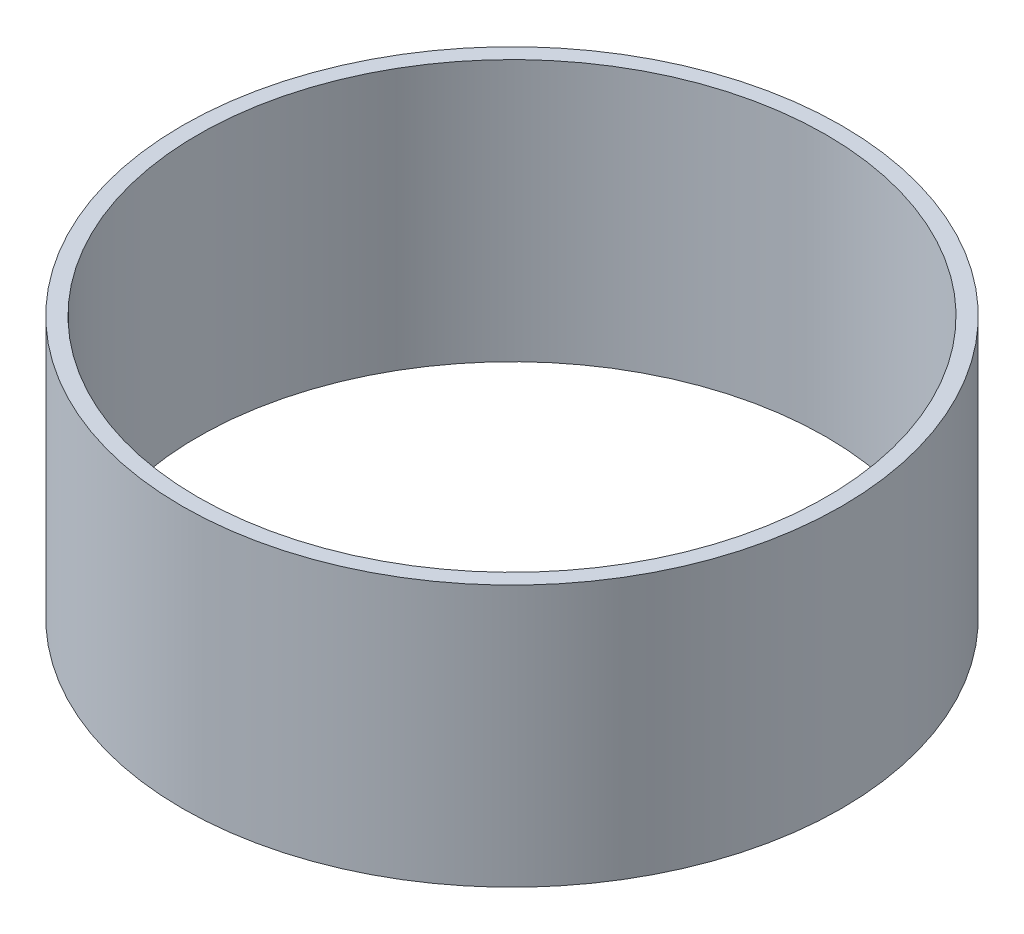
ISO-10303-21;
HEADER;
FILE_DESCRIPTION(('STEP AP214'),'2;1');
FILE_NAME('part.step','',(''),(''),'','','');
FILE_SCHEMA(('AUTOMOTIVE_DESIGN { 1 0 10303 214 1 1 1 1 }'));
ENDSEC;
DATA;
#1=APPLICATION_CONTEXT('core data for automotive mechanical design processes');
#2=APPLICATION_PROTOCOL_DEFINITION('international standard','automotive_design',2000,#1);
#3=PRODUCT_CONTEXT('',#1,'mechanical');
#4=PRODUCT('Part','Part','',(#3));
#5=PRODUCT_RELATED_PRODUCT_CATEGORY('part','',(#4));
#6=PRODUCT_DEFINITION_FORMATION('','',#4);
#7=PRODUCT_DEFINITION_CONTEXT('part definition',#1,'design');
#8=PRODUCT_DEFINITION('design','',#6,#7);
#9=PRODUCT_DEFINITION_SHAPE('','',#8);
#10=(LENGTH_UNIT() NAMED_UNIT(*) SI_UNIT(.MILLI.,.METRE.));
#11=(NAMED_UNIT(*) PLANE_ANGLE_UNIT() SI_UNIT($,.RADIAN.));
#12=(NAMED_UNIT(*) SI_UNIT($,.STERADIAN.) SOLID_ANGLE_UNIT());
#13=UNCERTAINTY_MEASURE_WITH_UNIT(LENGTH_MEASURE(1.E-05),#10,'distance_accuracy_value','');
#14=(GEOMETRIC_REPRESENTATION_CONTEXT(3) GLOBAL_UNCERTAINTY_ASSIGNED_CONTEXT((#13)) GLOBAL_UNIT_ASSIGNED_CONTEXT((#10,
#11,#12)) REPRESENTATION_CONTEXT('',''));
#15=CARTESIAN_POINT('',(0.,0.,0.));
#16=DIRECTION('',(0.,0.,1.));
#17=DIRECTION('',(1.,0.,0.));
#18=AXIS2_PLACEMENT_3D('',#15,#16,#17);
#19=CARTESIAN_POINT('',(0.,5.,0.));
#20=DIRECTION('',(0.,1.,0.));
#21=DIRECTION('',(0.,0.,1.));
#22=AXIS2_PLACEMENT_3D('',#19,#20,#21);
#23=PLANE('',#22);
#24=CARTESIAN_POINT('',(0.,5.,0.));
#25=DIRECTION('',(0.,1.,0.));
#26=DIRECTION('',(0.,0.,1.));
#27=AXIS2_PLACEMENT_3D('',#24,#25,#26);
#28=CIRCLE('',#27,6.3);
#29=CARTESIAN_POINT('',(0.,5.,6.3));
#30=VERTEX_POINT('',#29);
#31=EDGE_CURVE('E10',#30,#30,#28,.T.);
#32=ORIENTED_EDGE('',*,*,#31,.T.);
#33=EDGE_LOOP('',(#32));
#34=FACE_BOUND('',#33,.T.);
#35=CARTESIAN_POINT('',(0.,5.,0.));
#36=DIRECTION('',(0.,1.,0.));
#37=DIRECTION('',(0.,0.,1.));
#38=AXIS2_PLACEMENT_3D('',#35,#36,#37);
#39=CIRCLE('',#38,6.);
#40=CARTESIAN_POINT('',(0.,5.,6.));
#41=VERTEX_POINT('',#40);
#42=EDGE_CURVE('E44',#41,#41,#39,.T.);
#43=ORIENTED_EDGE('',*,*,#42,.F.);
#44=EDGE_LOOP('',(#43));
#45=FACE_BOUND('',#44,.T.);
#46=ADVANCED_FACE('F33',(#34,#45),#23,.T.);
#47=CARTESIAN_POINT('',(0.,0.,0.));
#48=DIRECTION('',(0.,1.,0.));
#49=DIRECTION('',(0.,0.,1.));
#50=AXIS2_PLACEMENT_3D('',#47,#48,#49);
#51=PLANE('',#50);
#52=CARTESIAN_POINT('',(0.,0.,0.));
#53=DIRECTION('',(0.,1.,0.));
#54=DIRECTION('',(0.,0.,1.));
#55=AXIS2_PLACEMENT_3D('',#52,#53,#54);
#56=CIRCLE('',#55,6.3);
#57=CARTESIAN_POINT('',(0.,0.,6.3));
#58=VERTEX_POINT('',#57);
#59=EDGE_CURVE('E37',#58,#58,#56,.T.);
#60=ORIENTED_EDGE('',*,*,#59,.F.);
#61=EDGE_LOOP('',(#60));
#62=FACE_BOUND('',#61,.T.);
#63=CARTESIAN_POINT('',(0.,0.,0.));
#64=DIRECTION('',(0.,1.,0.));
#65=DIRECTION('',(0.,0.,1.));
#66=AXIS2_PLACEMENT_3D('',#63,#64,#65);
#67=CIRCLE('',#66,6.);
#68=CARTESIAN_POINT('',(0.,0.,6.));
#69=VERTEX_POINT('',#68);
#70=EDGE_CURVE('E46',#69,#69,#67,.T.);
#71=ORIENTED_EDGE('',*,*,#70,.T.);
#72=EDGE_LOOP('',(#71));
#73=FACE_BOUND('',#72,.T.);
#74=ADVANCED_FACE('F56',(#62,#73),#51,.F.);
#75=CARTESIAN_POINT('',(0.,5.,0.));
#76=DIRECTION('',(0.,-1.,0.));
#77=DIRECTION('',(0.,0.,-1.));
#78=AXIS2_PLACEMENT_3D('',#75,#76,#77);
#79=CYLINDRICAL_SURFACE('',#78,6.3);
#80=ORIENTED_EDGE('',*,*,#31,.F.);
#81=EDGE_LOOP('',(#80));
#82=FACE_BOUND('',#81,.T.);
#83=ORIENTED_EDGE('',*,*,#59,.T.);
#84=EDGE_LOOP('',(#83));
#85=FACE_BOUND('',#84,.T.);
#86=ADVANCED_FACE('F35',(#82,#85),#79,.T.);
#87=CARTESIAN_POINT('',(0.,5.,0.));
#88=DIRECTION('',(0.,-1.,0.));
#89=DIRECTION('',(0.,0.,-1.));
#90=AXIS2_PLACEMENT_3D('',#87,#88,#89);
#91=CYLINDRICAL_SURFACE('',#90,6.);
#92=ORIENTED_EDGE('',*,*,#42,.T.);
#93=EDGE_LOOP('',(#92));
#94=FACE_BOUND('',#93,.T.);
#95=ORIENTED_EDGE('',*,*,#70,.F.);
#96=EDGE_LOOP('',(#95));
#97=FACE_BOUND('',#96,.T.);
#98=ADVANCED_FACE('F52',(#94,#97),#91,.F.);
#99=CLOSED_SHELL('',(#46,#74,#86,#98));
#100=MANIFOLD_SOLID_BREP('B2',#99);
#101=ADVANCED_BREP_SHAPE_REPRESENTATION('',(#18,#100),#14);
#102=SHAPE_DEFINITION_REPRESENTATION(#9,#101);
ENDSEC;
END-ISO-10303-21;
